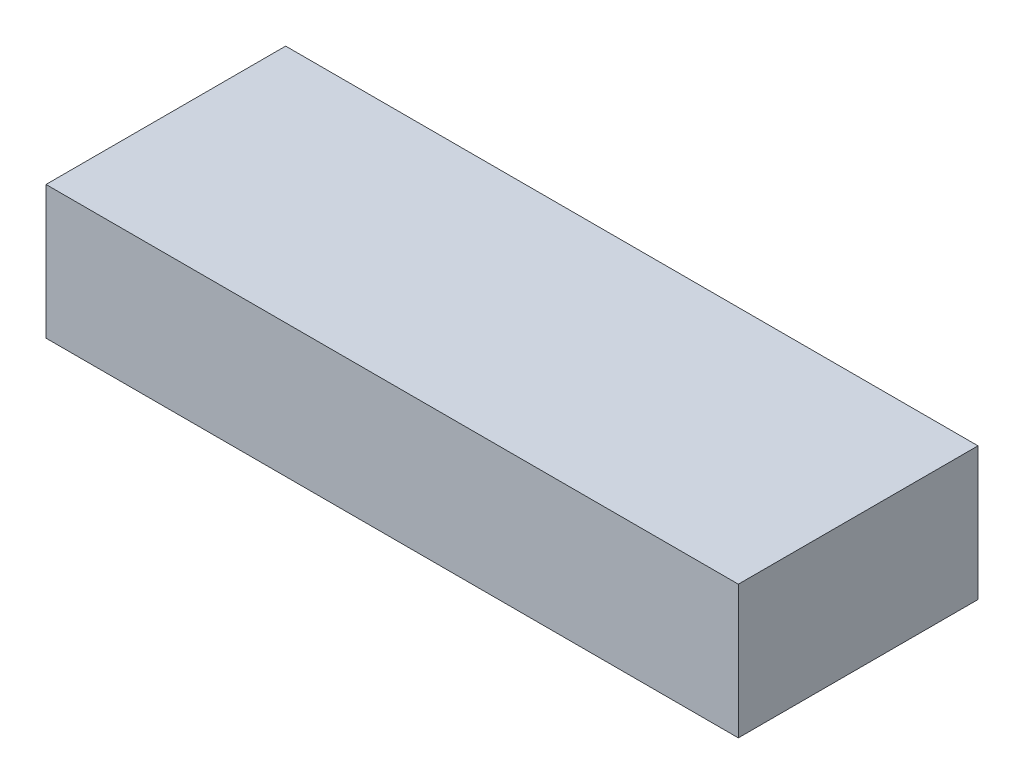
ISO-10303-21;
HEADER;
FILE_DESCRIPTION(('STEP AP214'),'2;1');
FILE_NAME('part.step','',(''),(''),'','','');
FILE_SCHEMA(('AUTOMOTIVE_DESIGN { 1 0 10303 214 1 1 1 1 }'));
ENDSEC;
DATA;
#1=APPLICATION_CONTEXT('core data for automotive mechanical design processes');
#2=APPLICATION_PROTOCOL_DEFINITION('international standard','automotive_design',2000,#1);
#3=PRODUCT_CONTEXT('',#1,'mechanical');
#4=PRODUCT('Part','Part','',(#3));
#5=PRODUCT_RELATED_PRODUCT_CATEGORY('part','',(#4));
#6=PRODUCT_DEFINITION_FORMATION('','',#4);
#7=PRODUCT_DEFINITION_CONTEXT('part definition',#1,'design');
#8=PRODUCT_DEFINITION('design','',#6,#7);
#9=PRODUCT_DEFINITION_SHAPE('','',#8);
#10=(LENGTH_UNIT() NAMED_UNIT(*) SI_UNIT(.MILLI.,.METRE.));
#11=(NAMED_UNIT(*) PLANE_ANGLE_UNIT() SI_UNIT($,.RADIAN.));
#12=(NAMED_UNIT(*) SI_UNIT($,.STERADIAN.) SOLID_ANGLE_UNIT());
#13=UNCERTAINTY_MEASURE_WITH_UNIT(LENGTH_MEASURE(1.E-05),#10,'distance_accuracy_value','');
#14=(GEOMETRIC_REPRESENTATION_CONTEXT(3) GLOBAL_UNCERTAINTY_ASSIGNED_CONTEXT((#13)) GLOBAL_UNIT_ASSIGNED_CONTEXT((#10,
#11,#12)) REPRESENTATION_CONTEXT('',''));
#15=CARTESIAN_POINT('',(0.,0.,0.));
#16=DIRECTION('',(0.,0.,1.));
#17=DIRECTION('',(1.,0.,0.));
#18=AXIS2_PLACEMENT_3D('',#15,#16,#17);
#19=CARTESIAN_POINT('',(-65.,25.,22.5));
#20=DIRECTION('',(1.,0.,0.));
#21=DIRECTION('',(0.,0.,-1.));
#22=AXIS2_PLACEMENT_3D('',#19,#20,#21);
#23=PLANE('',#22);
#24=DIRECTION('',(0.,0.,1.));
#25=VECTOR('',#24,1.);
#26=CARTESIAN_POINT('',(-65.,0.,22.5));
#27=LINE('',#26,#25);
#28=CARTESIAN_POINT('',(-65.,0.,-22.5));
#29=VERTEX_POINT('',#28);
#30=CARTESIAN_POINT('',(-65.,0.,22.5));
#31=VERTEX_POINT('',#30);
#32=EDGE_CURVE('E103',#29,#31,#27,.T.);
#33=ORIENTED_EDGE('',*,*,#32,.T.);
#34=DIRECTION('',(0.,-1.,0.));
#35=VECTOR('',#34,1.);
#36=CARTESIAN_POINT('',(-65.,25.,22.5));
#37=LINE('',#36,#35);
#38=CARTESIAN_POINT('',(-65.,25.,22.5));
#39=VERTEX_POINT('',#38);
#40=EDGE_CURVE('E11',#39,#31,#37,.T.);
#41=ORIENTED_EDGE('',*,*,#40,.F.);
#42=DIRECTION('',(0.,0.,1.));
#43=VECTOR('',#42,1.);
#44=CARTESIAN_POINT('',(-65.,25.,22.5));
#45=LINE('',#44,#43);
#46=CARTESIAN_POINT('',(-65.,25.,-22.5));
#47=VERTEX_POINT('',#46);
#48=EDGE_CURVE('E91',#47,#39,#45,.T.);
#49=ORIENTED_EDGE('',*,*,#48,.F.);
#50=DIRECTION('',(0.,-1.,0.));
#51=VECTOR('',#50,1.);
#52=CARTESIAN_POINT('',(-65.,25.,-22.5));
#53=LINE('',#52,#51);
#54=EDGE_CURVE('E99',#47,#29,#53,.T.);
#55=ORIENTED_EDGE('',*,*,#54,.T.);
#56=EDGE_LOOP('',(#33,#41,#49,#55));
#57=FACE_BOUND('',#56,.T.);
#58=ADVANCED_FACE('F40',(#57),#23,.F.);
#59=CARTESIAN_POINT('',(65.,25.,22.5));
#60=DIRECTION('',(0.,0.,-1.));
#61=DIRECTION('',(-1.,0.,0.));
#62=AXIS2_PLACEMENT_3D('',#59,#60,#61);
#63=PLANE('',#62);
#64=DIRECTION('',(1.,0.,0.));
#65=VECTOR('',#64,1.);
#66=CARTESIAN_POINT('',(65.,0.,22.5));
#67=LINE('',#66,#65);
#68=CARTESIAN_POINT('',(65.,0.,22.5));
#69=VERTEX_POINT('',#68);
#70=EDGE_CURVE('E95',#31,#69,#67,.T.);
#71=ORIENTED_EDGE('',*,*,#70,.T.);
#72=DIRECTION('',(0.,-1.,0.));
#73=VECTOR('',#72,1.);
#74=CARTESIAN_POINT('',(65.,25.,22.5));
#75=LINE('',#74,#73);
#76=CARTESIAN_POINT('',(65.,25.,22.5));
#77=VERTEX_POINT('',#76);
#78=EDGE_CURVE('E48',#77,#69,#75,.T.);
#79=ORIENTED_EDGE('',*,*,#78,.F.);
#80=DIRECTION('',(1.,0.,0.));
#81=VECTOR('',#80,1.);
#82=CARTESIAN_POINT('',(65.,25.,22.5));
#83=LINE('',#82,#81);
#84=EDGE_CURVE('E86',#39,#77,#83,.T.);
#85=ORIENTED_EDGE('',*,*,#84,.F.);
#86=ORIENTED_EDGE('',*,*,#40,.T.);
#87=EDGE_LOOP('',(#71,#79,#85,#86));
#88=FACE_BOUND('',#87,.T.);
#89=ADVANCED_FACE('F94',(#88),#63,.F.);
#90=CARTESIAN_POINT('',(65.,25.,22.5));
#91=DIRECTION('',(-1.,0.,0.));
#92=DIRECTION('',(0.,0.,1.));
#93=AXIS2_PLACEMENT_3D('',#90,#91,#92);
#94=PLANE('',#93);
#95=DIRECTION('',(0.,0.,-1.));
#96=VECTOR('',#95,1.);
#97=CARTESIAN_POINT('',(65.,0.,22.5));
#98=LINE('',#97,#96);
#99=CARTESIAN_POINT('',(65.,0.,-22.5));
#100=VERTEX_POINT('',#99);
#101=EDGE_CURVE('E73',#69,#100,#98,.T.);
#102=ORIENTED_EDGE('',*,*,#101,.T.);
#103=DIRECTION('',(0.,-1.,0.));
#104=VECTOR('',#103,1.);
#105=CARTESIAN_POINT('',(65.,25.,-22.5));
#106=LINE('',#105,#104);
#107=CARTESIAN_POINT('',(65.,25.,-22.5));
#108=VERTEX_POINT('',#107);
#109=EDGE_CURVE('E96',#108,#100,#106,.T.);
#110=ORIENTED_EDGE('',*,*,#109,.F.);
#111=DIRECTION('',(0.,0.,-1.));
#112=VECTOR('',#111,1.);
#113=CARTESIAN_POINT('',(65.,25.,22.5));
#114=LINE('',#113,#112);
#115=EDGE_CURVE('E89',#77,#108,#114,.T.);
#116=ORIENTED_EDGE('',*,*,#115,.F.);
#117=ORIENTED_EDGE('',*,*,#78,.T.);
#118=EDGE_LOOP('',(#102,#110,#116,#117));
#119=FACE_BOUND('',#118,.T.);
#120=ADVANCED_FACE('F97',(#119),#94,.F.);
#121=CARTESIAN_POINT('',(65.,25.,-22.5));
#122=DIRECTION('',(0.,0.,1.));
#123=DIRECTION('',(1.,0.,0.));
#124=AXIS2_PLACEMENT_3D('',#121,#122,#123);
#125=PLANE('',#124);
#126=DIRECTION('',(-1.,0.,0.));
#127=VECTOR('',#126,1.);
#128=CARTESIAN_POINT('',(65.,0.,-22.5));
#129=LINE('',#128,#127);
#130=EDGE_CURVE('E79',#100,#29,#129,.T.);
#131=ORIENTED_EDGE('',*,*,#130,.T.);
#132=ORIENTED_EDGE('',*,*,#54,.F.);
#133=DIRECTION('',(-1.,0.,0.));
#134=VECTOR('',#133,1.);
#135=CARTESIAN_POINT('',(65.,25.,-22.5));
#136=LINE('',#135,#134);
#137=EDGE_CURVE('E56',#108,#47,#136,.T.);
#138=ORIENTED_EDGE('',*,*,#137,.F.);
#139=ORIENTED_EDGE('',*,*,#109,.T.);
#140=EDGE_LOOP('',(#131,#132,#138,#139));
#141=FACE_BOUND('',#140,.T.);
#142=ADVANCED_FACE('F110',(#141),#125,.F.);
#143=CARTESIAN_POINT('',(0.,25.,0.));
#144=DIRECTION('',(0.,1.,0.));
#145=DIRECTION('',(0.,0.,1.));
#146=AXIS2_PLACEMENT_3D('',#143,#144,#145);
#147=PLANE('',#146);
#148=ORIENTED_EDGE('',*,*,#48,.T.);
#149=ORIENTED_EDGE('',*,*,#84,.T.);
#150=ORIENTED_EDGE('',*,*,#115,.T.);
#151=ORIENTED_EDGE('',*,*,#137,.T.);
#152=EDGE_LOOP('',(#148,#149,#150,#151));
#153=FACE_BOUND('',#152,.T.);
#154=ADVANCED_FACE('F87',(#153),#147,.T.);
#155=CARTESIAN_POINT('',(0.,0.,0.));
#156=DIRECTION('',(0.,1.,0.));
#157=DIRECTION('',(0.,0.,1.));
#158=AXIS2_PLACEMENT_3D('',#155,#156,#157);
#159=PLANE('',#158);
#160=ORIENTED_EDGE('',*,*,#32,.F.);
#161=ORIENTED_EDGE('',*,*,#130,.F.);
#162=ORIENTED_EDGE('',*,*,#101,.F.);
#163=ORIENTED_EDGE('',*,*,#70,.F.);
#164=EDGE_LOOP('',(#160,#161,#162,#163));
#165=FACE_BOUND('',#164,.T.);
#166=ADVANCED_FACE('F113',(#165),#159,.F.);
#167=CLOSED_SHELL('',(#58,#89,#120,#142,#154,#166));
#168=MANIFOLD_SOLID_BREP('B2',#167);
#169=ADVANCED_BREP_SHAPE_REPRESENTATION('',(#18,#168),#14);
#170=SHAPE_DEFINITION_REPRESENTATION(#9,#169);
ENDSEC;
END-ISO-10303-21;
